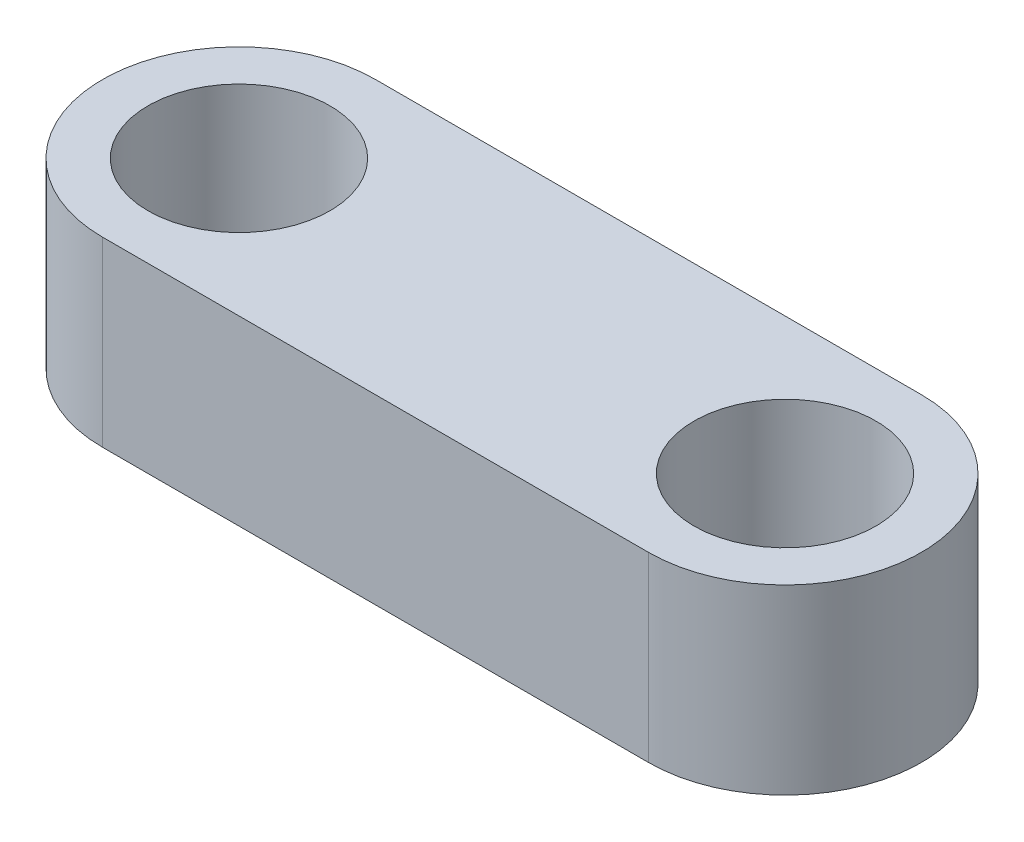
ISO-10303-21;
HEADER;
FILE_DESCRIPTION(('STEP AP214'),'2;1');
FILE_NAME('part.step','',(''),(''),'','','');
FILE_SCHEMA(('AUTOMOTIVE_DESIGN { 1 0 10303 214 1 1 1 1 }'));
ENDSEC;
DATA;
#1=APPLICATION_CONTEXT('core data for automotive mechanical design processes');
#2=APPLICATION_PROTOCOL_DEFINITION('international standard','automotive_design',2000,#1);
#3=PRODUCT_CONTEXT('',#1,'mechanical');
#4=PRODUCT('Part','Part','',(#3));
#5=PRODUCT_RELATED_PRODUCT_CATEGORY('part','',(#4));
#6=PRODUCT_DEFINITION_FORMATION('','',#4);
#7=PRODUCT_DEFINITION_CONTEXT('part definition',#1,'design');
#8=PRODUCT_DEFINITION('design','',#6,#7);
#9=PRODUCT_DEFINITION_SHAPE('','',#8);
#10=(LENGTH_UNIT() NAMED_UNIT(*) SI_UNIT(.MILLI.,.METRE.));
#11=(NAMED_UNIT(*) PLANE_ANGLE_UNIT() SI_UNIT($,.RADIAN.));
#12=(NAMED_UNIT(*) SI_UNIT($,.STERADIAN.) SOLID_ANGLE_UNIT());
#13=UNCERTAINTY_MEASURE_WITH_UNIT(LENGTH_MEASURE(1.E-05),#10,'distance_accuracy_value','');
#14=(GEOMETRIC_REPRESENTATION_CONTEXT(3) GLOBAL_UNCERTAINTY_ASSIGNED_CONTEXT((#13)) GLOBAL_UNIT_ASSIGNED_CONTEXT((#10,
#11,#12)) REPRESENTATION_CONTEXT('',''));
#15=CARTESIAN_POINT('',(0.,0.,0.));
#16=DIRECTION('',(0.,0.,1.));
#17=DIRECTION('',(1.,0.,0.));
#18=AXIS2_PLACEMENT_3D('',#15,#16,#17);
#19=CARTESIAN_POINT('',(3.75,8.75,0.));
#20=DIRECTION('',(0.,1.,0.));
#21=DIRECTION('',(0.,0.,1.));
#22=AXIS2_PLACEMENT_3D('',#19,#20,#21);
#23=PLANE('',#22);
#24=CARTESIAN_POINT('',(3.75,8.75,0.));
#25=DIRECTION('',(0.,1.,0.));
#26=DIRECTION('',(0.,0.,1.));
#27=AXIS2_PLACEMENT_3D('',#24,#25,#26);
#28=CIRCLE('',#27,3.75);
#29=CARTESIAN_POINT('',(3.75,8.75,3.75));
#30=VERTEX_POINT('',#29);
#31=EDGE_CURVE('E118',#30,#30,#28,.T.);
#32=ORIENTED_EDGE('',*,*,#31,.F.);
#33=EDGE_LOOP('',(#32));
#34=FACE_BOUND('',#33,.T.);
#35=CARTESIAN_POINT('',(3.75,8.75,0.));
#36=DIRECTION('',(0.,1.,0.));
#37=DIRECTION('',(0.,0.,1.));
#38=AXIS2_PLACEMENT_3D('',#35,#36,#37);
#39=CIRCLE('',#38,5.625);
#40=CARTESIAN_POINT('',(3.75,8.75,-5.625));
#41=VERTEX_POINT('',#40);
#42=CARTESIAN_POINT('',(3.75,8.75,5.625));
#43=VERTEX_POINT('',#42);
#44=EDGE_CURVE('E98',#41,#43,#39,.T.);
#45=ORIENTED_EDGE('',*,*,#44,.T.);
#46=DIRECTION('',(1.,0.,0.));
#47=VECTOR('',#46,1.);
#48=CARTESIAN_POINT('',(3.75,8.75,5.625));
#49=LINE('',#48,#47);
#50=CARTESIAN_POINT('',(26.25,8.75,5.625));
#51=VERTEX_POINT('',#50);
#52=EDGE_CURVE('E93',#43,#51,#49,.T.);
#53=ORIENTED_EDGE('',*,*,#52,.T.);
#54=CARTESIAN_POINT('',(26.25,8.75,0.));
#55=DIRECTION('',(0.,1.,0.));
#56=DIRECTION('',(0.,0.,1.));
#57=AXIS2_PLACEMENT_3D('',#54,#55,#56);
#58=CIRCLE('',#57,5.625);
#59=CARTESIAN_POINT('',(26.25,8.75,-5.625));
#60=VERTEX_POINT('',#59);
#61=EDGE_CURVE('E96',#51,#60,#58,.T.);
#62=ORIENTED_EDGE('',*,*,#61,.T.);
#63=DIRECTION('',(-1.,0.,0.));
#64=VECTOR('',#63,1.);
#65=CARTESIAN_POINT('',(3.75,8.75,-5.625));
#66=LINE('',#65,#64);
#67=EDGE_CURVE('E63',#60,#41,#66,.T.);
#68=ORIENTED_EDGE('',*,*,#67,.T.);
#69=EDGE_LOOP('',(#45,#53,#62,#68));
#70=FACE_BOUND('',#69,.T.);
#71=CARTESIAN_POINT('',(26.25,8.75,0.));
#72=DIRECTION('',(0.,1.,0.));
#73=DIRECTION('',(0.,0.,1.));
#74=AXIS2_PLACEMENT_3D('',#71,#72,#73);
#75=CIRCLE('',#74,3.75);
#76=CARTESIAN_POINT('',(26.25,8.75,3.75));
#77=VERTEX_POINT('',#76);
#78=EDGE_CURVE('E140',#77,#77,#75,.T.);
#79=ORIENTED_EDGE('',*,*,#78,.F.);
#80=EDGE_LOOP('',(#79));
#81=FACE_BOUND('',#80,.T.);
#82=ADVANCED_FACE('F45',(#34,#70,#81),#23,.T.);
#83=CARTESIAN_POINT('',(3.75,1.25,0.));
#84=DIRECTION('',(0.,1.,0.));
#85=DIRECTION('',(0.,0.,1.));
#86=AXIS2_PLACEMENT_3D('',#83,#84,#85);
#87=PLANE('',#86);
#88=CARTESIAN_POINT('',(3.75,1.25,0.));
#89=DIRECTION('',(0.,1.,0.));
#90=DIRECTION('',(0.,0.,1.));
#91=AXIS2_PLACEMENT_3D('',#88,#89,#90);
#92=CIRCLE('',#91,5.625);
#93=CARTESIAN_POINT('',(3.75,1.25,-5.625));
#94=VERTEX_POINT('',#93);
#95=CARTESIAN_POINT('',(3.75,1.25,5.625));
#96=VERTEX_POINT('',#95);
#97=EDGE_CURVE('E114',#94,#96,#92,.T.);
#98=ORIENTED_EDGE('',*,*,#97,.F.);
#99=DIRECTION('',(-1.,0.,0.));
#100=VECTOR('',#99,1.);
#101=CARTESIAN_POINT('',(3.75,1.25,-5.625));
#102=LINE('',#101,#100);
#103=CARTESIAN_POINT('',(26.25,1.25,-5.625));
#104=VERTEX_POINT('',#103);
#105=EDGE_CURVE('E86',#104,#94,#102,.T.);
#106=ORIENTED_EDGE('',*,*,#105,.F.);
#107=CARTESIAN_POINT('',(26.25,1.25,0.));
#108=DIRECTION('',(0.,1.,0.));
#109=DIRECTION('',(0.,0.,1.));
#110=AXIS2_PLACEMENT_3D('',#107,#108,#109);
#111=CIRCLE('',#110,5.625);
#112=CARTESIAN_POINT('',(26.25,1.25,5.625));
#113=VERTEX_POINT('',#112);
#114=EDGE_CURVE('E80',#113,#104,#111,.T.);
#115=ORIENTED_EDGE('',*,*,#114,.F.);
#116=DIRECTION('',(1.,0.,0.));
#117=VECTOR('',#116,1.);
#118=CARTESIAN_POINT('',(3.75,1.25,5.625));
#119=LINE('',#118,#117);
#120=EDGE_CURVE('E103',#96,#113,#119,.T.);
#121=ORIENTED_EDGE('',*,*,#120,.F.);
#122=EDGE_LOOP('',(#98,#106,#115,#121));
#123=FACE_BOUND('',#122,.T.);
#124=CARTESIAN_POINT('',(3.75,1.25,0.));
#125=DIRECTION('',(0.,1.,0.));
#126=DIRECTION('',(0.,0.,1.));
#127=AXIS2_PLACEMENT_3D('',#124,#125,#126);
#128=CIRCLE('',#127,3.75);
#129=CARTESIAN_POINT('',(3.75,1.25,3.75));
#130=VERTEX_POINT('',#129);
#131=EDGE_CURVE('E136',#130,#130,#128,.T.);
#132=ORIENTED_EDGE('',*,*,#131,.T.);
#133=EDGE_LOOP('',(#132));
#134=FACE_BOUND('',#133,.T.);
#135=CARTESIAN_POINT('',(26.25,1.25,0.));
#136=DIRECTION('',(0.,1.,0.));
#137=DIRECTION('',(0.,0.,1.));
#138=AXIS2_PLACEMENT_3D('',#135,#136,#137);
#139=CIRCLE('',#138,3.75);
#140=CARTESIAN_POINT('',(26.25,1.25,3.75));
#141=VERTEX_POINT('',#140);
#142=EDGE_CURVE('E144',#141,#141,#139,.T.);
#143=ORIENTED_EDGE('',*,*,#142,.T.);
#144=EDGE_LOOP('',(#143));
#145=FACE_BOUND('',#144,.T.);
#146=ADVANCED_FACE('F131',(#123,#134,#145),#87,.F.);
#147=CARTESIAN_POINT('',(3.75,8.75,0.));
#148=DIRECTION('',(0.,-1.,0.));
#149=DIRECTION('',(0.,0.,-1.));
#150=AXIS2_PLACEMENT_3D('',#147,#148,#149);
#151=CYLINDRICAL_SURFACE('',#150,5.625);
#152=ORIENTED_EDGE('',*,*,#97,.T.);
#153=DIRECTION('',(0.,-1.,0.));
#154=VECTOR('',#153,1.);
#155=CARTESIAN_POINT('',(3.75,8.75,5.625));
#156=LINE('',#155,#154);
#157=EDGE_CURVE('E11',#43,#96,#156,.T.);
#158=ORIENTED_EDGE('',*,*,#157,.F.);
#159=ORIENTED_EDGE('',*,*,#44,.F.);
#160=DIRECTION('',(0.,-1.,0.));
#161=VECTOR('',#160,1.);
#162=CARTESIAN_POINT('',(3.75,8.75,-5.625));
#163=LINE('',#162,#161);
#164=EDGE_CURVE('E110',#41,#94,#163,.T.);
#165=ORIENTED_EDGE('',*,*,#164,.T.);
#166=EDGE_LOOP('',(#152,#158,#159,#165));
#167=FACE_BOUND('',#166,.T.);
#168=ADVANCED_FACE('F47',(#167),#151,.T.);
#169=CARTESIAN_POINT('',(3.75,8.75,5.625));
#170=DIRECTION('',(0.,0.,-1.));
#171=DIRECTION('',(-1.,0.,0.));
#172=AXIS2_PLACEMENT_3D('',#169,#170,#171);
#173=PLANE('',#172);
#174=ORIENTED_EDGE('',*,*,#120,.T.);
#175=DIRECTION('',(0.,-1.,0.));
#176=VECTOR('',#175,1.);
#177=CARTESIAN_POINT('',(26.25,8.75,5.625));
#178=LINE('',#177,#176);
#179=EDGE_CURVE('E55',#51,#113,#178,.T.);
#180=ORIENTED_EDGE('',*,*,#179,.F.);
#181=ORIENTED_EDGE('',*,*,#52,.F.);
#182=ORIENTED_EDGE('',*,*,#157,.T.);
#183=EDGE_LOOP('',(#174,#180,#181,#182));
#184=FACE_BOUND('',#183,.T.);
#185=ADVANCED_FACE('F102',(#184),#173,.F.);
#186=CARTESIAN_POINT('',(26.25,8.75,0.));
#187=DIRECTION('',(0.,-1.,0.));
#188=DIRECTION('',(0.,0.,-1.));
#189=AXIS2_PLACEMENT_3D('',#186,#187,#188);
#190=CYLINDRICAL_SURFACE('',#189,5.625);
#191=ORIENTED_EDGE('',*,*,#114,.T.);
#192=DIRECTION('',(0.,-1.,0.));
#193=VECTOR('',#192,1.);
#194=CARTESIAN_POINT('',(26.25,8.75,-5.625));
#195=LINE('',#194,#193);
#196=EDGE_CURVE('E105',#60,#104,#195,.T.);
#197=ORIENTED_EDGE('',*,*,#196,.F.);
#198=ORIENTED_EDGE('',*,*,#61,.F.);
#199=ORIENTED_EDGE('',*,*,#179,.T.);
#200=EDGE_LOOP('',(#191,#197,#198,#199));
#201=FACE_BOUND('',#200,.T.);
#202=ADVANCED_FACE('F106',(#201),#190,.T.);
#203=CARTESIAN_POINT('',(3.75,8.75,-5.625));
#204=DIRECTION('',(0.,0.,1.));
#205=DIRECTION('',(1.,0.,0.));
#206=AXIS2_PLACEMENT_3D('',#203,#204,#205);
#207=PLANE('',#206);
#208=ORIENTED_EDGE('',*,*,#105,.T.);
#209=ORIENTED_EDGE('',*,*,#164,.F.);
#210=ORIENTED_EDGE('',*,*,#67,.F.);
#211=ORIENTED_EDGE('',*,*,#196,.T.);
#212=EDGE_LOOP('',(#208,#209,#210,#211));
#213=FACE_BOUND('',#212,.T.);
#214=ADVANCED_FACE('F128',(#213),#207,.F.);
#215=CARTESIAN_POINT('',(3.75,8.75,0.));
#216=DIRECTION('',(0.,-1.,0.));
#217=DIRECTION('',(0.,0.,-1.));
#218=AXIS2_PLACEMENT_3D('',#215,#216,#217);
#219=CYLINDRICAL_SURFACE('',#218,3.75);
#220=ORIENTED_EDGE('',*,*,#31,.T.);
#221=EDGE_LOOP('',(#220));
#222=FACE_BOUND('',#221,.T.);
#223=ORIENTED_EDGE('',*,*,#131,.F.);
#224=EDGE_LOOP('',(#223));
#225=FACE_BOUND('',#224,.T.);
#226=ADVANCED_FACE('F163',(#222,#225),#219,.F.);
#227=CARTESIAN_POINT('',(26.25,8.75,0.));
#228=DIRECTION('',(0.,-1.,0.));
#229=DIRECTION('',(0.,0.,-1.));
#230=AXIS2_PLACEMENT_3D('',#227,#228,#229);
#231=CYLINDRICAL_SURFACE('',#230,3.75);
#232=ORIENTED_EDGE('',*,*,#78,.T.);
#233=EDGE_LOOP('',(#232));
#234=FACE_BOUND('',#233,.T.);
#235=ORIENTED_EDGE('',*,*,#142,.F.);
#236=EDGE_LOOP('',(#235));
#237=FACE_BOUND('',#236,.T.);
#238=ADVANCED_FACE('F152',(#234,#237),#231,.F.);
#239=CLOSED_SHELL('',(#82,#146,#168,#185,#202,#214,#226,#238));
#240=MANIFOLD_SOLID_BREP('B2',#239);
#241=ADVANCED_BREP_SHAPE_REPRESENTATION('',(#18,#240),#14);
#242=SHAPE_DEFINITION_REPRESENTATION(#9,#241);
ENDSEC;
END-ISO-10303-21;
